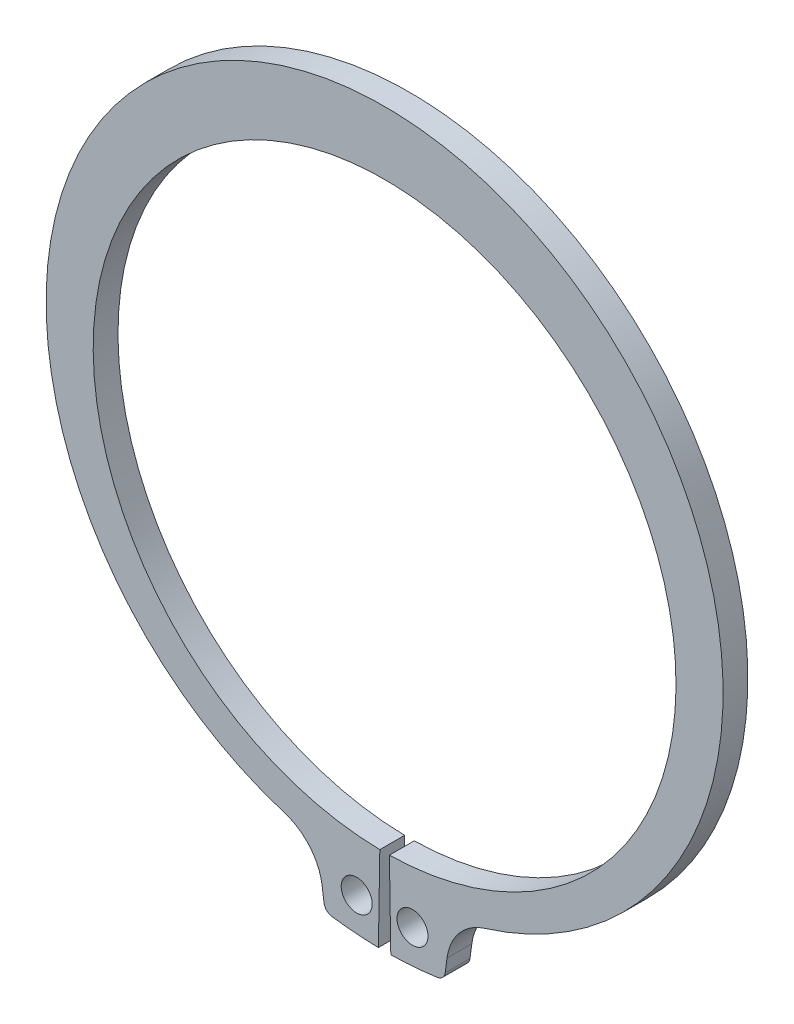
ISO-10303-21;
HEADER;
FILE_DESCRIPTION(('STEP AP214'),'2;1');
FILE_NAME('part.step','',(''),(''),'','','');
FILE_SCHEMA(('AUTOMOTIVE_DESIGN { 1 0 10303 214 1 1 1 1 }'));
ENDSEC;
DATA;
#1=APPLICATION_CONTEXT('core data for automotive mechanical design processes');
#2=APPLICATION_PROTOCOL_DEFINITION('international standard','automotive_design',2000,#1);
#3=PRODUCT_CONTEXT('',#1,'mechanical');
#4=PRODUCT('Part','Part','',(#3));
#5=PRODUCT_RELATED_PRODUCT_CATEGORY('part','',(#4));
#6=PRODUCT_DEFINITION_FORMATION('','',#4);
#7=PRODUCT_DEFINITION_CONTEXT('part definition',#1,'design');
#8=PRODUCT_DEFINITION('design','',#6,#7);
#9=PRODUCT_DEFINITION_SHAPE('','',#8);
#10=(LENGTH_UNIT() NAMED_UNIT(*) SI_UNIT(.MILLI.,.METRE.));
#11=(NAMED_UNIT(*) PLANE_ANGLE_UNIT() SI_UNIT($,.RADIAN.));
#12=(NAMED_UNIT(*) SI_UNIT($,.STERADIAN.) SOLID_ANGLE_UNIT());
#13=UNCERTAINTY_MEASURE_WITH_UNIT(LENGTH_MEASURE(1.E-05),#10,'distance_accuracy_value','');
#14=(GEOMETRIC_REPRESENTATION_CONTEXT(3) GLOBAL_UNCERTAINTY_ASSIGNED_CONTEXT((#13)) GLOBAL_UNIT_ASSIGNED_CONTEXT((#10,
#11,#12)) REPRESENTATION_CONTEXT('',''));
#15=CARTESIAN_POINT('',(0.,0.,0.));
#16=DIRECTION('',(0.,0.,1.));
#17=DIRECTION('',(1.,0.,0.));
#18=AXIS2_PLACEMENT_3D('',#15,#16,#17);
#19=CARTESIAN_POINT('',(0.,0.,-2.));
#20=DIRECTION('',(0.,0.,1.));
#21=DIRECTION('',(1.,0.,0.));
#22=AXIS2_PLACEMENT_3D('',#19,#20,#21);
#23=CYLINDRICAL_SURFACE('',#22,23.5);
#24=CARTESIAN_POINT('',(0.,0.,0.));
#25=DIRECTION('',(0.,0.,-1.));
#26=DIRECTION('',(1.,0.,0.));
#27=AXIS2_PLACEMENT_3D('',#24,#25,#26);
#28=CIRCLE('',#27,23.5);
#29=CARTESIAN_POINT('',(-0.386513157894737,-23.4968212228543,0.));
#30=VERTEX_POINT('',#29);
#31=CARTESIAN_POINT('',(0.386513157894737,-23.4968212228543,0.));
#32=VERTEX_POINT('',#31);
#33=EDGE_CURVE('E155',#30,#32,#28,.T.);
#34=ORIENTED_EDGE('',*,*,#33,.F.);
#35=DIRECTION('',(0.,0.,1.));
#36=VECTOR('',#35,1.);
#37=CARTESIAN_POINT('',(-0.386513157894737,-23.4968212228543,-2.));
#38=LINE('',#37,#36);
#39=CARTESIAN_POINT('',(-0.386513157894737,-23.4968212228543,-2.));
#40=VERTEX_POINT('',#39);
#41=EDGE_CURVE('E11',#40,#30,#38,.T.);
#42=ORIENTED_EDGE('',*,*,#41,.F.);
#43=CARTESIAN_POINT('',(0.,0.,-2.));
#44=DIRECTION('',(0.,0.,-1.));
#45=DIRECTION('',(1.,0.,0.));
#46=AXIS2_PLACEMENT_3D('',#43,#44,#45);
#47=CIRCLE('',#46,23.5);
#48=CARTESIAN_POINT('',(0.386513157894737,-23.4968212228543,-2.));
#49=VERTEX_POINT('',#48);
#50=EDGE_CURVE('E188',#40,#49,#47,.T.);
#51=ORIENTED_EDGE('',*,*,#50,.T.);
#52=DIRECTION('',(0.,0.,1.));
#53=VECTOR('',#52,1.);
#54=CARTESIAN_POINT('',(0.386513157894737,-23.4968212228543,-2.));
#55=LINE('',#54,#53);
#56=EDGE_CURVE('E37',#49,#32,#55,.T.);
#57=ORIENTED_EDGE('',*,*,#56,.T.);
#58=EDGE_LOOP('',(#34,#42,#51,#57));
#59=FACE_BOUND('',#58,.T.);
#60=ADVANCED_FACE('F34',(#59),#23,.F.);
#61=CARTESIAN_POINT('',(-0.386513157894737,-23.4968212228543,-2.));
#62=DIRECTION('',(0.999864732887415,-0.0164473684210526,0.));
#63=DIRECTION('',(0.0164473684210526,0.999864732887415,0.));
#64=AXIS2_PLACEMENT_3D('',#61,#62,#63);
#65=PLANE('',#64);
#66=DIRECTION('',(0.0164473684210526,0.999864732887415,0.));
#67=VECTOR('',#66,1.);
#68=CARTESIAN_POINT('',(-0.386513157894737,-23.4968212228543,0.));
#69=LINE('',#68,#67);
#70=CARTESIAN_POINT('',(-0.5,-30.3958878797774,0.));
#71=VERTEX_POINT('',#70);
#72=EDGE_CURVE('E186',#71,#30,#69,.T.);
#73=ORIENTED_EDGE('',*,*,#72,.F.);
#74=DIRECTION('',(0.,0.,1.));
#75=VECTOR('',#74,1.);
#76=CARTESIAN_POINT('',(-0.5,-30.3958878797774,-2.));
#77=LINE('',#76,#75);
#78=CARTESIAN_POINT('',(-0.5,-30.3958878797774,-2.));
#79=VERTEX_POINT('',#78);
#80=EDGE_CURVE('E43',#79,#71,#77,.T.);
#81=ORIENTED_EDGE('',*,*,#80,.F.);
#82=DIRECTION('',(0.0164473684210526,0.999864732887415,0.));
#83=VECTOR('',#82,1.);
#84=CARTESIAN_POINT('',(-0.386513157894737,-23.4968212228543,-2.));
#85=LINE('',#84,#83);
#86=EDGE_CURVE('E145',#79,#40,#85,.T.);
#87=ORIENTED_EDGE('',*,*,#86,.T.);
#88=ORIENTED_EDGE('',*,*,#41,.T.);
#89=EDGE_LOOP('',(#73,#81,#87,#88));
#90=FACE_BOUND('',#89,.T.);
#91=ADVANCED_FACE('F208',(#90),#65,.T.);
#92=CARTESIAN_POINT('',(0.,0.,-2.));
#93=DIRECTION('',(0.,0.,1.));
#94=DIRECTION('',(1.,0.,0.));
#95=AXIS2_PLACEMENT_3D('',#92,#93,#94);
#96=CYLINDRICAL_SURFACE('',#95,30.4);
#97=CARTESIAN_POINT('',(0.,0.,0.));
#98=DIRECTION('',(0.,0.,1.));
#99=DIRECTION('',(1.,0.,0.));
#100=AXIS2_PLACEMENT_3D('',#97,#98,#99);
#101=CIRCLE('',#100,30.4);
#102=CARTESIAN_POINT('',(-4.24976993373491,-30.1014859352545,0.));
#103=VERTEX_POINT('',#102);
#104=EDGE_CURVE('E132',#103,#71,#101,.T.);
#105=ORIENTED_EDGE('',*,*,#104,.F.);
#106=DIRECTION('',(0.,0.,1.));
#107=VECTOR('',#106,1.);
#108=CARTESIAN_POINT('',(-4.24976993373491,-30.1014859352545,-2.));
#109=LINE('',#108,#107);
#110=CARTESIAN_POINT('',(-4.24976993373491,-30.1014859352545,-2.));
#111=VERTEX_POINT('',#110);
#112=EDGE_CURVE('E127',#111,#103,#109,.T.);
#113=ORIENTED_EDGE('',*,*,#112,.F.);
#114=CARTESIAN_POINT('',(0.,0.,-2.));
#115=DIRECTION('',(0.,0.,1.));
#116=DIRECTION('',(1.,0.,0.));
#117=AXIS2_PLACEMENT_3D('',#114,#115,#116);
#118=CIRCLE('',#117,30.4);
#119=EDGE_CURVE('E130',#111,#79,#118,.T.);
#120=ORIENTED_EDGE('',*,*,#119,.T.);
#121=ORIENTED_EDGE('',*,*,#80,.T.);
#122=EDGE_LOOP('',(#105,#113,#120,#121));
#123=FACE_BOUND('',#122,.T.);
#124=ADVANCED_FACE('F129',(#123),#96,.T.);
#125=CARTESIAN_POINT('',(-4.14492363602761,-29.3588505914571,-2.));
#126=DIRECTION('',(0.,0.,1.));
#127=DIRECTION('',(1.,0.,0.));
#128=AXIS2_PLACEMENT_3D('',#125,#126,#127);
#129=CYLINDRICAL_SURFACE('',#128,0.750000000000003);
#130=CARTESIAN_POINT('',(-4.14492363602761,-29.3588505914571,0.));
#131=DIRECTION('',(0.,0.,1.));
#132=DIRECTION('',(1.,0.,0.));
#133=AXIS2_PLACEMENT_3D('',#130,#131,#132);
#134=CIRCLE('',#133,0.750000000000003);
#135=CARTESIAN_POINT('',(-4.88850728205797,-29.4567452356221,0.));
#136=VERTEX_POINT('',#135);
#137=EDGE_CURVE('E183',#136,#103,#134,.T.);
#138=ORIENTED_EDGE('',*,*,#137,.F.);
#139=DIRECTION('',(0.,0.,1.));
#140=VECTOR('',#139,1.);
#141=CARTESIAN_POINT('',(-4.88850728205797,-29.4567452356221,-2.));
#142=LINE('',#141,#140);
#143=CARTESIAN_POINT('',(-4.88850728205797,-29.4567452356221,-2.));
#144=VERTEX_POINT('',#143);
#145=EDGE_CURVE('E137',#144,#136,#142,.T.);
#146=ORIENTED_EDGE('',*,*,#145,.F.);
#147=CARTESIAN_POINT('',(-4.14492363602761,-29.3588505914571,-2.));
#148=DIRECTION('',(0.,0.,1.));
#149=DIRECTION('',(1.,0.,0.));
#150=AXIS2_PLACEMENT_3D('',#147,#148,#149);
#151=CIRCLE('',#150,0.750000000000003);
#152=EDGE_CURVE('E143',#144,#111,#151,.T.);
#153=ORIENTED_EDGE('',*,*,#152,.T.);
#154=ORIENTED_EDGE('',*,*,#112,.T.);
#155=EDGE_LOOP('',(#138,#146,#153,#154));
#156=FACE_BOUND('',#155,.T.);
#157=ADVANCED_FACE('F147',(#156),#129,.T.);
#158=CARTESIAN_POINT('',(-5.03286840650434,-28.3602136308909,-2.));
#159=DIRECTION('',(-0.99144486137381,-0.130526192220053,0.));
#160=DIRECTION('',(0.130526192220053,-0.99144486137381,0.));
#161=AXIS2_PLACEMENT_3D('',#158,#159,#160);
#162=PLANE('',#161);
#163=DIRECTION('',(0.130526192220053,-0.99144486137381,0.));
#164=VECTOR('',#163,1.);
#165=CARTESIAN_POINT('',(-5.03286840650434,-28.3602136308909,0.));
#166=LINE('',#165,#164);
#167=CARTESIAN_POINT('',(-5.03286840650434,-28.3602136308909,0.));
#168=VERTEX_POINT('',#167);
#169=EDGE_CURVE('E180',#168,#136,#166,.T.);
#170=ORIENTED_EDGE('',*,*,#169,.F.);
#171=DIRECTION('',(0.,0.,1.));
#172=VECTOR('',#171,1.);
#173=CARTESIAN_POINT('',(-5.03286840650434,-28.3602136308909,-2.));
#174=LINE('',#173,#172);
#175=CARTESIAN_POINT('',(-5.03286840650434,-28.3602136308909,-2.));
#176=VERTEX_POINT('',#175);
#177=EDGE_CURVE('E192',#176,#168,#174,.T.);
#178=ORIENTED_EDGE('',*,*,#177,.F.);
#179=DIRECTION('',(0.130526192220053,-0.99144486137381,0.));
#180=VECTOR('',#179,1.);
#181=CARTESIAN_POINT('',(-5.03286840650434,-28.3602136308909,-2.));
#182=LINE('',#181,#180);
#183=EDGE_CURVE('E148',#176,#144,#182,.T.);
#184=ORIENTED_EDGE('',*,*,#183,.T.);
#185=ORIENTED_EDGE('',*,*,#145,.T.);
#186=EDGE_LOOP('',(#170,#178,#184,#185));
#187=FACE_BOUND('',#186,.T.);
#188=ADVANCED_FACE('F221',(#187),#162,.T.);
#189=CARTESIAN_POINT('',(-9.34525166253846,-28.9279496571019,-2.));
#190=DIRECTION('',(0.,0.,1.));
#191=DIRECTION('',(1.,0.,0.));
#192=AXIS2_PLACEMENT_3D('',#189,#190,#191);
#193=CYLINDRICAL_SURFACE('',#192,4.34959464115694);
#194=CARTESIAN_POINT('',(-9.34525166253846,-28.9279496571019,0.));
#195=DIRECTION('',(0.,0.,-1.));
#196=DIRECTION('',(1.,0.,0.));
#197=AXIS2_PLACEMENT_3D('',#194,#195,#196);
#198=CIRCLE('',#197,4.34959464115694);
#199=CARTESIAN_POINT('',(-8.06072845026789,-24.77235419321,0.));
#200=VERTEX_POINT('',#199);
#201=EDGE_CURVE('E177',#200,#168,#198,.T.);
#202=ORIENTED_EDGE('',*,*,#201,.F.);
#203=DIRECTION('',(0.,0.,1.));
#204=VECTOR('',#203,1.);
#205=CARTESIAN_POINT('',(-8.06072845026789,-24.77235419321,-2.));
#206=LINE('',#205,#204);
#207=CARTESIAN_POINT('',(-8.06072845026789,-24.77235419321,-2.));
#208=VERTEX_POINT('',#207);
#209=EDGE_CURVE('E194',#208,#200,#206,.T.);
#210=ORIENTED_EDGE('',*,*,#209,.F.);
#211=CARTESIAN_POINT('',(-9.34525166253846,-28.9279496571019,-2.));
#212=DIRECTION('',(0.,0.,-1.));
#213=DIRECTION('',(1.,0.,0.));
#214=AXIS2_PLACEMENT_3D('',#211,#212,#213);
#215=CIRCLE('',#214,4.34959464115694);
#216=EDGE_CURVE('E150',#208,#176,#215,.T.);
#217=ORIENTED_EDGE('',*,*,#216,.T.);
#218=ORIENTED_EDGE('',*,*,#177,.T.);
#219=EDGE_LOOP('',(#202,#210,#217,#218));
#220=FACE_BOUND('',#219,.T.);
#221=ADVANCED_FACE('F224',(#220),#193,.F.);
#222=CARTESIAN_POINT('',(0.,1.30512441022246,-2.));
#223=DIRECTION('',(0.,0.,1.));
#224=DIRECTION('',(1.,0.,0.));
#225=AXIS2_PLACEMENT_3D('',#222,#223,#224);
#226=CYLINDRICAL_SURFACE('',#225,27.2948755897775);
#227=CARTESIAN_POINT('',(0.,1.30512441022246,0.));
#228=DIRECTION('',(0.,0.,1.));
#229=DIRECTION('',(1.,0.,0.));
#230=AXIS2_PLACEMENT_3D('',#227,#228,#229);
#231=CIRCLE('',#230,27.2948755897775);
#232=CARTESIAN_POINT('',(8.0607284502679,-24.77235419321,0.));
#233=VERTEX_POINT('',#232);
#234=EDGE_CURVE('E174',#233,#200,#231,.T.);
#235=ORIENTED_EDGE('',*,*,#234,.F.);
#236=DIRECTION('',(0.,0.,1.));
#237=VECTOR('',#236,1.);
#238=CARTESIAN_POINT('',(8.0607284502679,-24.77235419321,-2.));
#239=LINE('',#238,#237);
#240=CARTESIAN_POINT('',(8.0607284502679,-24.77235419321,-2.));
#241=VERTEX_POINT('',#240);
#242=EDGE_CURVE('E196',#241,#233,#239,.T.);
#243=ORIENTED_EDGE('',*,*,#242,.F.);
#244=CARTESIAN_POINT('',(0.,1.30512441022246,-2.));
#245=DIRECTION('',(0.,0.,1.));
#246=DIRECTION('',(1.,0.,0.));
#247=AXIS2_PLACEMENT_3D('',#244,#245,#246);
#248=CIRCLE('',#247,27.2948755897775);
#249=EDGE_CURVE('E298',#241,#208,#248,.T.);
#250=ORIENTED_EDGE('',*,*,#249,.T.);
#251=ORIENTED_EDGE('',*,*,#209,.T.);
#252=EDGE_LOOP('',(#235,#243,#250,#251));
#253=FACE_BOUND('',#252,.T.);
#254=ADVANCED_FACE('F228',(#253),#226,.T.);
#255=CARTESIAN_POINT('',(9.34525166253846,-28.9279496571019,-2.));
#256=DIRECTION('',(0.,0.,1.));
#257=DIRECTION('',(1.,0.,0.));
#258=AXIS2_PLACEMENT_3D('',#255,#256,#257);
#259=CYLINDRICAL_SURFACE('',#258,4.34959464115694);
#260=CARTESIAN_POINT('',(9.34525166253846,-28.9279496571019,0.));
#261=DIRECTION('',(0.,0.,-1.));
#262=DIRECTION('',(1.,0.,0.));
#263=AXIS2_PLACEMENT_3D('',#260,#261,#262);
#264=CIRCLE('',#263,4.34959464115694);
#265=CARTESIAN_POINT('',(5.03286840650435,-28.3602136308909,0.));
#266=VERTEX_POINT('',#265);
#267=EDGE_CURVE('E171',#266,#233,#264,.T.);
#268=ORIENTED_EDGE('',*,*,#267,.F.);
#269=DIRECTION('',(0.,0.,1.));
#270=VECTOR('',#269,1.);
#271=CARTESIAN_POINT('',(5.03286840650435,-28.3602136308909,-2.));
#272=LINE('',#271,#270);
#273=CARTESIAN_POINT('',(5.03286840650435,-28.3602136308909,-2.));
#274=VERTEX_POINT('',#273);
#275=EDGE_CURVE('E198',#274,#266,#272,.T.);
#276=ORIENTED_EDGE('',*,*,#275,.F.);
#277=CARTESIAN_POINT('',(9.34525166253846,-28.9279496571019,-2.));
#278=DIRECTION('',(0.,0.,-1.));
#279=DIRECTION('',(1.,0.,0.));
#280=AXIS2_PLACEMENT_3D('',#277,#278,#279);
#281=CIRCLE('',#280,4.34959464115694);
#282=EDGE_CURVE('E295',#274,#241,#281,.T.);
#283=ORIENTED_EDGE('',*,*,#282,.T.);
#284=ORIENTED_EDGE('',*,*,#242,.T.);
#285=EDGE_LOOP('',(#268,#276,#283,#284));
#286=FACE_BOUND('',#285,.T.);
#287=ADVANCED_FACE('F232',(#286),#259,.F.);
#288=CARTESIAN_POINT('',(5.03286840650434,-28.3602136308909,-2.));
#289=DIRECTION('',(0.99144486137381,-0.130526192220053,0.));
#290=DIRECTION('',(0.130526192220053,0.99144486137381,0.));
#291=AXIS2_PLACEMENT_3D('',#288,#289,#290);
#292=PLANE('',#291);
#293=DIRECTION('',(0.130526192220053,0.99144486137381,0.));
#294=VECTOR('',#293,1.);
#295=CARTESIAN_POINT('',(5.03286840650434,-28.3602136308909,0.));
#296=LINE('',#295,#294);
#297=CARTESIAN_POINT('',(4.88850728205797,-29.4567452356221,0.));
#298=VERTEX_POINT('',#297);
#299=EDGE_CURVE('E168',#298,#266,#296,.T.);
#300=ORIENTED_EDGE('',*,*,#299,.F.);
#301=DIRECTION('',(0.,0.,1.));
#302=VECTOR('',#301,1.);
#303=CARTESIAN_POINT('',(4.88850728205797,-29.4567452356221,-2.));
#304=LINE('',#303,#302);
#305=CARTESIAN_POINT('',(4.88850728205797,-29.4567452356221,-2.));
#306=VERTEX_POINT('',#305);
#307=EDGE_CURVE('E200',#306,#298,#304,.T.);
#308=ORIENTED_EDGE('',*,*,#307,.F.);
#309=DIRECTION('',(0.130526192220053,0.99144486137381,0.));
#310=VECTOR('',#309,1.);
#311=CARTESIAN_POINT('',(5.03286840650434,-28.3602136308909,-2.));
#312=LINE('',#311,#310);
#313=EDGE_CURVE('E292',#306,#274,#312,.T.);
#314=ORIENTED_EDGE('',*,*,#313,.T.);
#315=ORIENTED_EDGE('',*,*,#275,.T.);
#316=EDGE_LOOP('',(#300,#308,#314,#315));
#317=FACE_BOUND('',#316,.T.);
#318=ADVANCED_FACE('F236',(#317),#292,.T.);
#319=CARTESIAN_POINT('',(4.14492363602761,-29.3588505914571,-2.));
#320=DIRECTION('',(0.,0.,1.));
#321=DIRECTION('',(1.,0.,0.));
#322=AXIS2_PLACEMENT_3D('',#319,#320,#321);
#323=CYLINDRICAL_SURFACE('',#322,0.750000000000003);
#324=CARTESIAN_POINT('',(4.14492363602761,-29.3588505914571,0.));
#325=DIRECTION('',(0.,0.,1.));
#326=DIRECTION('',(-1.,0.,0.));
#327=AXIS2_PLACEMENT_3D('',#324,#325,#326);
#328=CIRCLE('',#327,0.750000000000003);
#329=CARTESIAN_POINT('',(4.24976993373489,-30.1014859352545,0.));
#330=VERTEX_POINT('',#329);
#331=EDGE_CURVE('E165',#330,#298,#328,.T.);
#332=ORIENTED_EDGE('',*,*,#331,.F.);
#333=DIRECTION('',(0.,0.,1.));
#334=VECTOR('',#333,1.);
#335=CARTESIAN_POINT('',(4.24976993373489,-30.1014859352545,-2.));
#336=LINE('',#335,#334);
#337=CARTESIAN_POINT('',(4.24976993373489,-30.1014859352545,-2.));
#338=VERTEX_POINT('',#337);
#339=EDGE_CURVE('E202',#338,#330,#336,.T.);
#340=ORIENTED_EDGE('',*,*,#339,.F.);
#341=CARTESIAN_POINT('',(4.14492363602761,-29.3588505914571,-2.));
#342=DIRECTION('',(0.,0.,1.));
#343=DIRECTION('',(-1.,0.,0.));
#344=AXIS2_PLACEMENT_3D('',#341,#342,#343);
#345=CIRCLE('',#344,0.750000000000003);
#346=EDGE_CURVE('E289',#338,#306,#345,.T.);
#347=ORIENTED_EDGE('',*,*,#346,.T.);
#348=ORIENTED_EDGE('',*,*,#307,.T.);
#349=EDGE_LOOP('',(#332,#340,#347,#348));
#350=FACE_BOUND('',#349,.T.);
#351=ADVANCED_FACE('F240',(#350),#323,.T.);
#352=CARTESIAN_POINT('',(0.,0.,-2.));
#353=DIRECTION('',(0.,0.,1.));
#354=DIRECTION('',(1.,0.,0.));
#355=AXIS2_PLACEMENT_3D('',#352,#353,#354);
#356=CYLINDRICAL_SURFACE('',#355,30.4);
#357=CARTESIAN_POINT('',(0.,0.,0.));
#358=DIRECTION('',(0.,0.,1.));
#359=DIRECTION('',(1.,0.,0.));
#360=AXIS2_PLACEMENT_3D('',#357,#358,#359);
#361=CIRCLE('',#360,30.4);
#362=CARTESIAN_POINT('',(0.499999999999992,-30.3958878797774,0.));
#363=VERTEX_POINT('',#362);
#364=EDGE_CURVE('E162',#363,#330,#361,.T.);
#365=ORIENTED_EDGE('',*,*,#364,.F.);
#366=DIRECTION('',(0.,0.,1.));
#367=VECTOR('',#366,1.);
#368=CARTESIAN_POINT('',(0.499999999999992,-30.3958878797774,-2.));
#369=LINE('',#368,#367);
#370=CARTESIAN_POINT('',(0.499999999999992,-30.3958878797774,-2.));
#371=VERTEX_POINT('',#370);
#372=EDGE_CURVE('E203',#371,#363,#369,.T.);
#373=ORIENTED_EDGE('',*,*,#372,.F.);
#374=CARTESIAN_POINT('',(0.,0.,-2.));
#375=DIRECTION('',(0.,0.,1.));
#376=DIRECTION('',(1.,0.,0.));
#377=AXIS2_PLACEMENT_3D('',#374,#375,#376);
#378=CIRCLE('',#377,30.4);
#379=EDGE_CURVE('E286',#371,#338,#378,.T.);
#380=ORIENTED_EDGE('',*,*,#379,.T.);
#381=ORIENTED_EDGE('',*,*,#339,.T.);
#382=EDGE_LOOP('',(#365,#373,#380,#381));
#383=FACE_BOUND('',#382,.T.);
#384=ADVANCED_FACE('F244',(#383),#356,.T.);
#385=CARTESIAN_POINT('',(0.386513157894737,-23.4968212228543,-2.));
#386=DIRECTION('',(-0.999864732887415,-0.0164473684210526,0.));
#387=DIRECTION('',(0.0164473684210526,-0.999864732887415,0.));
#388=AXIS2_PLACEMENT_3D('',#385,#386,#387);
#389=PLANE('',#388);
#390=DIRECTION('',(0.0164473684210526,-0.999864732887415,0.));
#391=VECTOR('',#390,1.);
#392=CARTESIAN_POINT('',(0.386513157894737,-23.4968212228543,0.));
#393=LINE('',#392,#391);
#394=EDGE_CURVE('E158',#32,#363,#393,.T.);
#395=ORIENTED_EDGE('',*,*,#394,.F.);
#396=ORIENTED_EDGE('',*,*,#56,.F.);
#397=DIRECTION('',(0.0164473684210526,-0.999864732887415,0.));
#398=VECTOR('',#397,1.);
#399=CARTESIAN_POINT('',(0.386513157894737,-23.4968212228543,-2.));
#400=LINE('',#399,#398);
#401=EDGE_CURVE('E284',#49,#371,#400,.T.);
#402=ORIENTED_EDGE('',*,*,#401,.T.);
#403=ORIENTED_EDGE('',*,*,#372,.T.);
#404=EDGE_LOOP('',(#395,#396,#402,#403));
#405=FACE_BOUND('',#404,.T.);
#406=ADVANCED_FACE('F205',(#405),#389,.T.);
#407=CARTESIAN_POINT('',(0.,0.,-2.));
#408=DIRECTION('',(0.,0.,1.));
#409=DIRECTION('',(1.,0.,0.));
#410=AXIS2_PLACEMENT_3D('',#407,#408,#409);
#411=PLANE('',#410);
#412=CARTESIAN_POINT('',(-2.25,-27.6084679038877,-2.));
#413=DIRECTION('',(0.,0.,1.));
#414=DIRECTION('',(1.,0.,0.));
#415=AXIS2_PLACEMENT_3D('',#412,#413,#414);
#416=CIRCLE('',#415,1.25);
#417=CARTESIAN_POINT('',(-0.999999999999999,-27.6084679038877,-2.));
#418=VERTEX_POINT('',#417);
#419=EDGE_CURVE('E271',#418,#418,#416,.T.);
#420=ORIENTED_EDGE('',*,*,#419,.T.);
#421=EDGE_LOOP('',(#420));
#422=FACE_BOUND('',#421,.T.);
#423=CARTESIAN_POINT('',(2.25,-27.6084679038877,-2.));
#424=DIRECTION('',(0.,0.,1.));
#425=DIRECTION('',(1.,0.,0.));
#426=AXIS2_PLACEMENT_3D('',#423,#424,#425);
#427=CIRCLE('',#426,1.25);
#428=CARTESIAN_POINT('',(3.5,-27.6084679038877,-2.));
#429=VERTEX_POINT('',#428);
#430=EDGE_CURVE('E159',#429,#429,#427,.T.);
#431=ORIENTED_EDGE('',*,*,#430,.T.);
#432=EDGE_LOOP('',(#431));
#433=FACE_BOUND('',#432,.T.);
#434=ORIENTED_EDGE('',*,*,#50,.F.);
#435=ORIENTED_EDGE('',*,*,#86,.F.);
#436=ORIENTED_EDGE('',*,*,#119,.F.);
#437=ORIENTED_EDGE('',*,*,#152,.F.);
#438=ORIENTED_EDGE('',*,*,#183,.F.);
#439=ORIENTED_EDGE('',*,*,#216,.F.);
#440=ORIENTED_EDGE('',*,*,#249,.F.);
#441=ORIENTED_EDGE('',*,*,#282,.F.);
#442=ORIENTED_EDGE('',*,*,#313,.F.);
#443=ORIENTED_EDGE('',*,*,#346,.F.);
#444=ORIENTED_EDGE('',*,*,#379,.F.);
#445=ORIENTED_EDGE('',*,*,#401,.F.);
#446=EDGE_LOOP('',(#434,#435,#436,#437,#438,#439,#440,#441,#442,#443,#444,#445));
#447=FACE_BOUND('',#446,.T.);
#448=ADVANCED_FACE('F141',(#422,#433,#447),#411,.F.);
#449=CARTESIAN_POINT('',(0.,0.,0.));
#450=DIRECTION('',(0.,0.,1.));
#451=DIRECTION('',(1.,0.,0.));
#452=AXIS2_PLACEMENT_3D('',#449,#450,#451);
#453=PLANE('',#452);
#454=CARTESIAN_POINT('',(-2.25,-27.6084679038877,0.));
#455=DIRECTION('',(0.,0.,1.));
#456=DIRECTION('',(1.,0.,0.));
#457=AXIS2_PLACEMENT_3D('',#454,#455,#456);
#458=CIRCLE('',#457,1.25);
#459=CARTESIAN_POINT('',(-0.999999999999999,-27.6084679038877,0.));
#460=VERTEX_POINT('',#459);
#461=EDGE_CURVE('E274',#460,#460,#458,.T.);
#462=ORIENTED_EDGE('',*,*,#461,.F.);
#463=EDGE_LOOP('',(#462));
#464=FACE_BOUND('',#463,.T.);
#465=CARTESIAN_POINT('',(2.25,-27.6084679038877,0.));
#466=DIRECTION('',(0.,0.,1.));
#467=DIRECTION('',(1.,0.,0.));
#468=AXIS2_PLACEMENT_3D('',#465,#466,#467);
#469=CIRCLE('',#468,1.25);
#470=CARTESIAN_POINT('',(3.5,-27.6084679038877,0.));
#471=VERTEX_POINT('',#470);
#472=EDGE_CURVE('E276',#471,#471,#469,.T.);
#473=ORIENTED_EDGE('',*,*,#472,.F.);
#474=EDGE_LOOP('',(#473));
#475=FACE_BOUND('',#474,.T.);
#476=ORIENTED_EDGE('',*,*,#33,.T.);
#477=ORIENTED_EDGE('',*,*,#394,.T.);
#478=ORIENTED_EDGE('',*,*,#364,.T.);
#479=ORIENTED_EDGE('',*,*,#331,.T.);
#480=ORIENTED_EDGE('',*,*,#299,.T.);
#481=ORIENTED_EDGE('',*,*,#267,.T.);
#482=ORIENTED_EDGE('',*,*,#234,.T.);
#483=ORIENTED_EDGE('',*,*,#201,.T.);
#484=ORIENTED_EDGE('',*,*,#169,.T.);
#485=ORIENTED_EDGE('',*,*,#137,.T.);
#486=ORIENTED_EDGE('',*,*,#104,.T.);
#487=ORIENTED_EDGE('',*,*,#72,.T.);
#488=EDGE_LOOP('',(#476,#477,#478,#479,#480,#481,#482,#483,#484,#485,#486,#487));
#489=FACE_BOUND('',#488,.T.);
#490=ADVANCED_FACE('F207',(#464,#475,#489),#453,.T.);
#491=CARTESIAN_POINT('',(2.25,-27.6084679038877,-2.));
#492=DIRECTION('',(0.,0.,1.));
#493=DIRECTION('',(1.,0.,0.));
#494=AXIS2_PLACEMENT_3D('',#491,#492,#493);
#495=CYLINDRICAL_SURFACE('',#494,1.25);
#496=ORIENTED_EDGE('',*,*,#430,.F.);
#497=EDGE_LOOP('',(#496));
#498=FACE_BOUND('',#497,.T.);
#499=ORIENTED_EDGE('',*,*,#472,.T.);
#500=EDGE_LOOP('',(#499));
#501=FACE_BOUND('',#500,.T.);
#502=ADVANCED_FACE('F256',(#498,#501),#495,.F.);
#503=CARTESIAN_POINT('',(-2.25,-27.6084679038877,-2.));
#504=DIRECTION('',(0.,0.,1.));
#505=DIRECTION('',(1.,0.,0.));
#506=AXIS2_PLACEMENT_3D('',#503,#504,#505);
#507=CYLINDRICAL_SURFACE('',#506,1.25);
#508=ORIENTED_EDGE('',*,*,#419,.F.);
#509=EDGE_LOOP('',(#508));
#510=FACE_BOUND('',#509,.T.);
#511=ORIENTED_EDGE('',*,*,#461,.T.);
#512=EDGE_LOOP('',(#511));
#513=FACE_BOUND('',#512,.T.);
#514=ADVANCED_FACE('F263',(#510,#513),#507,.F.);
#515=CLOSED_SHELL('',(#60,#91,#124,#157,#188,#221,#254,#287,#318,#351,#384,#406,#448,#490,#502,#514));
#516=MANIFOLD_SOLID_BREP('B2',#515);
#517=ADVANCED_BREP_SHAPE_REPRESENTATION('',(#18,#516),#14);
#518=SHAPE_DEFINITION_REPRESENTATION(#9,#517);
ENDSEC;
END-ISO-10303-21;
